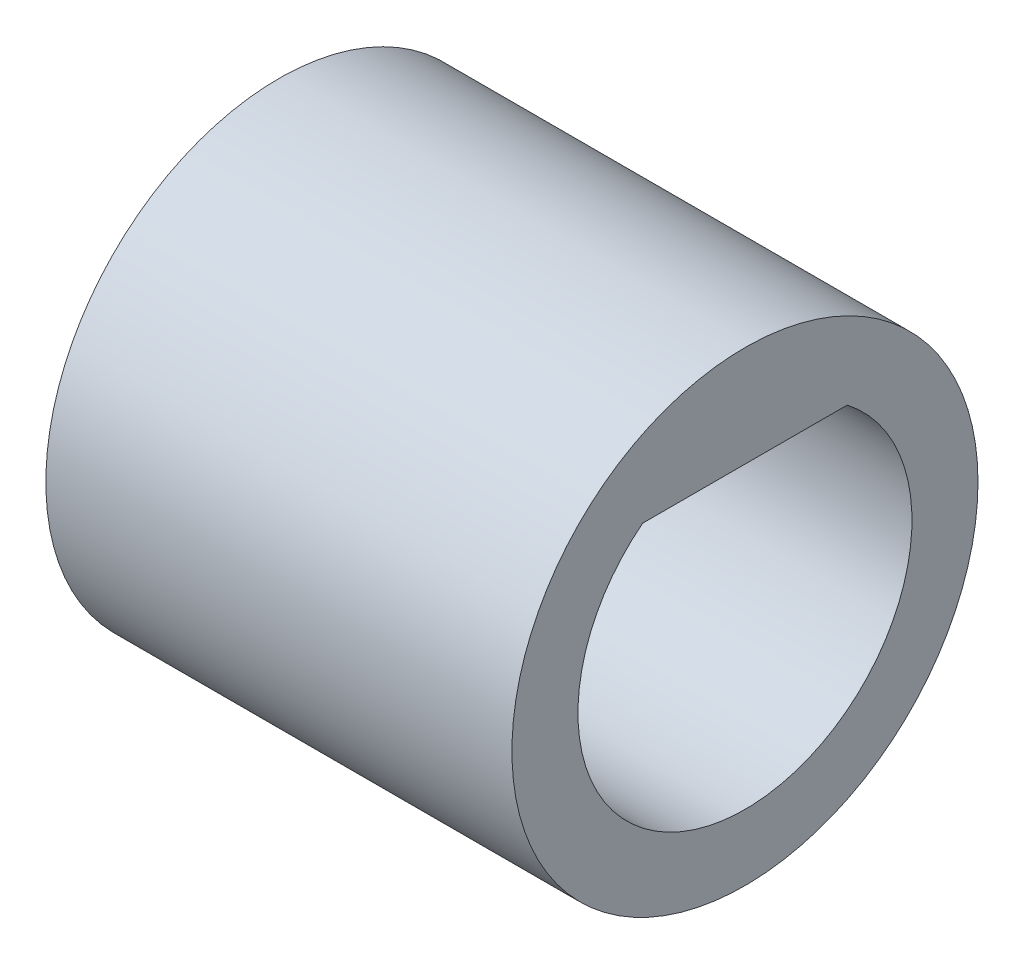
ISO-10303-21;
HEADER;
FILE_DESCRIPTION(('STEP AP214'),'2;1');
FILE_NAME('part.step','',(''),(''),'','','');
FILE_SCHEMA(('AUTOMOTIVE_DESIGN { 1 0 10303 214 1 1 1 1 }'));
ENDSEC;
DATA;
#1=APPLICATION_CONTEXT('core data for automotive mechanical design processes');
#2=APPLICATION_PROTOCOL_DEFINITION('international standard','automotive_design',2000,#1);
#3=PRODUCT_CONTEXT('',#1,'mechanical');
#4=PRODUCT('Part','Part','',(#3));
#5=PRODUCT_RELATED_PRODUCT_CATEGORY('part','',(#4));
#6=PRODUCT_DEFINITION_FORMATION('','',#4);
#7=PRODUCT_DEFINITION_CONTEXT('part definition',#1,'design');
#8=PRODUCT_DEFINITION('design','',#6,#7);
#9=PRODUCT_DEFINITION_SHAPE('','',#8);
#10=(LENGTH_UNIT() NAMED_UNIT(*) SI_UNIT(.MILLI.,.METRE.));
#11=(NAMED_UNIT(*) PLANE_ANGLE_UNIT() SI_UNIT($,.RADIAN.));
#12=(NAMED_UNIT(*) SI_UNIT($,.STERADIAN.) SOLID_ANGLE_UNIT());
#13=UNCERTAINTY_MEASURE_WITH_UNIT(LENGTH_MEASURE(1.E-05),#10,'distance_accuracy_value','');
#14=(GEOMETRIC_REPRESENTATION_CONTEXT(3) GLOBAL_UNCERTAINTY_ASSIGNED_CONTEXT((#13)) GLOBAL_UNIT_ASSIGNED_CONTEXT((#10,
#11,#12)) REPRESENTATION_CONTEXT('',''));
#15=CARTESIAN_POINT('',(0.,0.,0.));
#16=DIRECTION('',(0.,0.,1.));
#17=DIRECTION('',(1.,0.,0.));
#18=AXIS2_PLACEMENT_3D('',#15,#16,#17);
#19=CARTESIAN_POINT('',(6.,0.,0.));
#20=DIRECTION('',(-1.,0.,0.));
#21=DIRECTION('',(0.,0.,1.));
#22=AXIS2_PLACEMENT_3D('',#19,#20,#21);
#23=CYLINDRICAL_SURFACE('',#22,3.);
#24=CARTESIAN_POINT('',(6.,0.,0.));
#25=DIRECTION('',(1.,0.,0.));
#26=DIRECTION('',(0.,0.,-1.));
#27=AXIS2_PLACEMENT_3D('',#24,#25,#26);
#28=CIRCLE('',#27,3.);
#29=CARTESIAN_POINT('',(6.,0.,-3.));
#30=VERTEX_POINT('',#29);
#31=EDGE_CURVE('E11',#30,#30,#28,.T.);
#32=ORIENTED_EDGE('',*,*,#31,.F.);
#33=EDGE_LOOP('',(#32));
#34=FACE_BOUND('',#33,.T.);
#35=CARTESIAN_POINT('',(0.,0.,0.));
#36=DIRECTION('',(1.,0.,0.));
#37=DIRECTION('',(0.,0.,-1.));
#38=AXIS2_PLACEMENT_3D('',#35,#36,#37);
#39=CIRCLE('',#38,3.);
#40=CARTESIAN_POINT('',(0.,0.,-3.));
#41=VERTEX_POINT('',#40);
#42=EDGE_CURVE('E38',#41,#41,#39,.T.);
#43=ORIENTED_EDGE('',*,*,#42,.T.);
#44=EDGE_LOOP('',(#43));
#45=FACE_BOUND('',#44,.T.);
#46=ADVANCED_FACE('F35',(#34,#45),#23,.T.);
#47=CARTESIAN_POINT('',(6.,0.,0.));
#48=DIRECTION('',(1.,0.,0.));
#49=DIRECTION('',(0.,0.,-1.));
#50=AXIS2_PLACEMENT_3D('',#47,#48,#49);
#51=PLANE('',#50);
#52=CARTESIAN_POINT('',(6.,0.,0.));
#53=DIRECTION('',(1.,0.,0.));
#54=DIRECTION('',(0.,0.,-1.));
#55=AXIS2_PLACEMENT_3D('',#52,#53,#54);
#56=CIRCLE('',#55,2.15);
#57=CARTESIAN_POINT('',(6.,1.7,1.31624465810882));
#58=VERTEX_POINT('',#57);
#59=CARTESIAN_POINT('',(6.,1.7,-1.31624465810882));
#60=VERTEX_POINT('',#59);
#61=EDGE_CURVE('E49',#58,#60,#56,.T.);
#62=ORIENTED_EDGE('',*,*,#61,.F.);
#63=DIRECTION('',(0.,0.,1.));
#64=VECTOR('',#63,1.);
#65=CARTESIAN_POINT('',(6.,1.7,1.31624465810882));
#66=LINE('',#65,#64);
#67=EDGE_CURVE('E68',#60,#58,#66,.T.);
#68=ORIENTED_EDGE('',*,*,#67,.F.);
#69=EDGE_LOOP('',(#62,#68));
#70=FACE_BOUND('',#69,.T.);
#71=ORIENTED_EDGE('',*,*,#31,.T.);
#72=EDGE_LOOP('',(#71));
#73=FACE_BOUND('',#72,.T.);
#74=ADVANCED_FACE('F72',(#70,#73),#51,.T.);
#75=CARTESIAN_POINT('',(0.,0.,0.));
#76=DIRECTION('',(1.,0.,0.));
#77=DIRECTION('',(0.,0.,-1.));
#78=AXIS2_PLACEMENT_3D('',#75,#76,#77);
#79=PLANE('',#78);
#80=ORIENTED_EDGE('',*,*,#42,.F.);
#81=EDGE_LOOP('',(#80));
#82=FACE_BOUND('',#81,.T.);
#83=ADVANCED_FACE('F92',(#82),#79,.F.);
#84=CARTESIAN_POINT('',(1.,0.,0.));
#85=DIRECTION('',(1.,0.,0.));
#86=DIRECTION('',(0.,0.,-1.));
#87=AXIS2_PLACEMENT_3D('',#84,#85,#86);
#88=CYLINDRICAL_SURFACE('',#87,2.15);
#89=ORIENTED_EDGE('',*,*,#61,.T.);
#90=DIRECTION('',(1.,0.,0.));
#91=VECTOR('',#90,1.);
#92=CARTESIAN_POINT('',(1.,1.7,-1.31624465810882));
#93=LINE('',#92,#91);
#94=CARTESIAN_POINT('',(1.,1.7,-1.31624465810882));
#95=VERTEX_POINT('',#94);
#96=EDGE_CURVE('E65',#95,#60,#93,.T.);
#97=ORIENTED_EDGE('',*,*,#96,.F.);
#98=CARTESIAN_POINT('',(1.,0.,0.));
#99=DIRECTION('',(1.,0.,0.));
#100=DIRECTION('',(0.,0.,-1.));
#101=AXIS2_PLACEMENT_3D('',#98,#99,#100);
#102=CIRCLE('',#101,2.15);
#103=CARTESIAN_POINT('',(1.,1.7,1.31624465810882));
#104=VERTEX_POINT('',#103);
#105=EDGE_CURVE('E63',#104,#95,#102,.T.);
#106=ORIENTED_EDGE('',*,*,#105,.F.);
#107=DIRECTION('',(1.,0.,0.));
#108=VECTOR('',#107,1.);
#109=CARTESIAN_POINT('',(1.,1.7,1.31624465810882));
#110=LINE('',#109,#108);
#111=EDGE_CURVE('E57',#104,#58,#110,.T.);
#112=ORIENTED_EDGE('',*,*,#111,.T.);
#113=EDGE_LOOP('',(#89,#97,#106,#112));
#114=FACE_BOUND('',#113,.T.);
#115=ADVANCED_FACE('F61',(#114),#88,.F.);
#116=CARTESIAN_POINT('',(1.,1.7,1.31624465810882));
#117=DIRECTION('',(0.,1.,0.));
#118=DIRECTION('',(0.,0.,1.));
#119=AXIS2_PLACEMENT_3D('',#116,#117,#118);
#120=PLANE('',#119);
#121=ORIENTED_EDGE('',*,*,#67,.T.);
#122=ORIENTED_EDGE('',*,*,#111,.F.);
#123=DIRECTION('',(0.,0.,1.));
#124=VECTOR('',#123,1.);
#125=CARTESIAN_POINT('',(1.,1.7,1.31624465810882));
#126=LINE('',#125,#124);
#127=EDGE_CURVE('E76',#95,#104,#126,.T.);
#128=ORIENTED_EDGE('',*,*,#127,.F.);
#129=ORIENTED_EDGE('',*,*,#96,.T.);
#130=EDGE_LOOP('',(#121,#122,#128,#129));
#131=FACE_BOUND('',#130,.T.);
#132=ADVANCED_FACE('F69',(#131),#120,.F.);
#133=CARTESIAN_POINT('',(1.,0.,0.));
#134=DIRECTION('',(1.,0.,0.));
#135=DIRECTION('',(0.,0.,-1.));
#136=AXIS2_PLACEMENT_3D('',#133,#134,#135);
#137=PLANE('',#136);
#138=ORIENTED_EDGE('',*,*,#105,.T.);
#139=ORIENTED_EDGE('',*,*,#127,.T.);
#140=EDGE_LOOP('',(#138,#139));
#141=FACE_BOUND('',#140,.T.);
#142=ADVANCED_FACE('F80',(#141),#137,.T.);
#143=CLOSED_SHELL('',(#46,#74,#83,#115,#132,#142));
#144=MANIFOLD_SOLID_BREP('B2',#143);
#145=ADVANCED_BREP_SHAPE_REPRESENTATION('',(#18,#144),#14);
#146=SHAPE_DEFINITION_REPRESENTATION(#9,#145);
ENDSEC;
END-ISO-10303-21;
